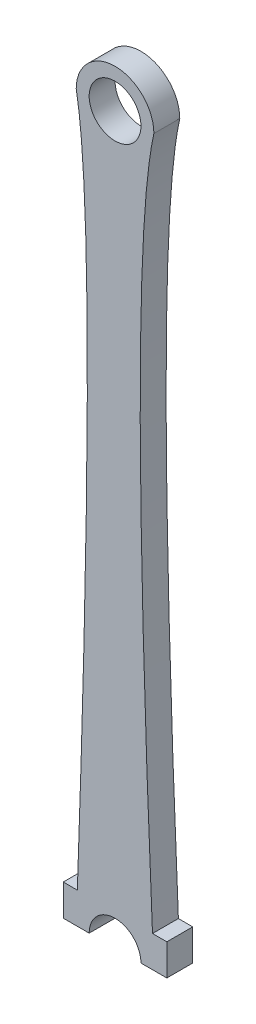
ISO-10303-21;
HEADER;
FILE_DESCRIPTION(('STEP AP214'),'2;1');
FILE_NAME('part.step','',(''),(''),'','','');
FILE_SCHEMA(('AUTOMOTIVE_DESIGN { 1 0 10303 214 1 1 1 1 }'));
ENDSEC;
DATA;
#1=APPLICATION_CONTEXT('core data for automotive mechanical design processes');
#2=APPLICATION_PROTOCOL_DEFINITION('international standard','automotive_design',2000,#1);
#3=PRODUCT_CONTEXT('',#1,'mechanical');
#4=PRODUCT('Part','Part','',(#3));
#5=PRODUCT_RELATED_PRODUCT_CATEGORY('part','',(#4));
#6=PRODUCT_DEFINITION_FORMATION('','',#4);
#7=PRODUCT_DEFINITION_CONTEXT('part definition',#1,'design');
#8=PRODUCT_DEFINITION('design','',#6,#7);
#9=PRODUCT_DEFINITION_SHAPE('','',#8);
#10=(LENGTH_UNIT() NAMED_UNIT(*) SI_UNIT(.MILLI.,.METRE.));
#11=(NAMED_UNIT(*) PLANE_ANGLE_UNIT() SI_UNIT($,.RADIAN.));
#12=(NAMED_UNIT(*) SI_UNIT($,.STERADIAN.) SOLID_ANGLE_UNIT());
#13=UNCERTAINTY_MEASURE_WITH_UNIT(LENGTH_MEASURE(1.E-05),#10,'distance_accuracy_value','');
#14=(GEOMETRIC_REPRESENTATION_CONTEXT(3) GLOBAL_UNCERTAINTY_ASSIGNED_CONTEXT((#13)) GLOBAL_UNIT_ASSIGNED_CONTEXT((#10,
#11,#12)) REPRESENTATION_CONTEXT('',''));
#15=CARTESIAN_POINT('',(0.,0.,0.));
#16=DIRECTION('',(0.,0.,1.));
#17=DIRECTION('',(1.,0.,0.));
#18=AXIS2_PLACEMENT_3D('',#15,#16,#17);
#19=CARTESIAN_POINT('',(0.,-75.2678433281264,10.));
#20=DIRECTION('',(0.,0.,1.));
#21=DIRECTION('',(1.,0.,0.));
#22=AXIS2_PLACEMENT_3D('',#19,#20,#21);
#23=PLANE('',#22);
#24=CARTESIAN_POINT('',(0.,-75.2678433281264,10.));
#25=DIRECTION('',(0.,0.,-1.));
#26=DIRECTION('',(1.,0.,0.));
#27=AXIS2_PLACEMENT_3D('',#24,#25,#26);
#28=CIRCLE('',#27,10.);
#29=CARTESIAN_POINT('',(-10.,-75.2678433281264,10.));
#30=VERTEX_POINT('',#29);
#31=CARTESIAN_POINT('',(10.,-75.2678433281264,10.));
#32=VERTEX_POINT('',#31);
#33=EDGE_CURVE('E182',#30,#32,#28,.T.);
#34=ORIENTED_EDGE('',*,*,#33,.T.);
#35=DIRECTION('',(1.,0.,0.));
#36=VECTOR('',#35,1.);
#37=CARTESIAN_POINT('',(10.,-75.2678433281264,10.));
#38=LINE('',#37,#36);
#39=CARTESIAN_POINT('',(20.,-75.2678433281264,10.));
#40=VERTEX_POINT('',#39);
#41=EDGE_CURVE('E104',#32,#40,#38,.T.);
#42=ORIENTED_EDGE('',*,*,#41,.T.);
#43=DIRECTION('',(0.,1.,0.));
#44=VECTOR('',#43,1.);
#45=CARTESIAN_POINT('',(20.,-75.2678433281264,10.));
#46=LINE('',#45,#44);
#47=CARTESIAN_POINT('',(20.,-63.1536003688616,10.));
#48=VERTEX_POINT('',#47);
#49=EDGE_CURVE('E203',#40,#48,#46,.T.);
#50=ORIENTED_EDGE('',*,*,#49,.T.);
#51=DIRECTION('',(-1.,0.,0.));
#52=VECTOR('',#51,1.);
#53=CARTESIAN_POINT('',(20.,-63.1536003688616,10.));
#54=LINE('',#53,#52);
#55=CARTESIAN_POINT('',(14.4593400547385,-63.1536003688616,10.));
#56=VERTEX_POINT('',#55);
#57=EDGE_CURVE('E220',#48,#56,#54,.T.);
#58=ORIENTED_EDGE('',*,*,#57,.T.);
#59=CARTESIAN_POINT('',(14.4593400547385,-63.1536003688616,10.));
#60=CARTESIAN_POINT('',(7.95408171619363,85.0557570926602,10.));
#61=CARTESIAN_POINT('',(8.13430169794981,174.351009439518,10.));
#62=CARTESIAN_POINT('',(15.,204.732156671874,10.));
#63=B_SPLINE_CURVE_WITH_KNOTS('',3,(#59,#60,#61,#62),.UNSPECIFIED.,.F.,.F.,(4,4),(0.,
0.973750669804579),.UNSPECIFIED.);
#64=CARTESIAN_POINT('',(15.,204.732156671874,10.));
#65=VERTEX_POINT('',#64);
#66=EDGE_CURVE('E217',#56,#65,#63,.T.);
#67=ORIENTED_EDGE('',*,*,#66,.T.);
#68=CARTESIAN_POINT('',(0.,204.732156671874,10.));
#69=DIRECTION('',(0.,0.,1.));
#70=DIRECTION('',(1.,0.,0.));
#71=AXIS2_PLACEMENT_3D('',#68,#69,#70);
#72=CIRCLE('',#71,15.);
#73=CARTESIAN_POINT('',(-15.,204.732156671874,10.));
#74=VERTEX_POINT('',#73);
#75=EDGE_CURVE('E219',#65,#74,#72,.T.);
#76=ORIENTED_EDGE('',*,*,#75,.T.);
#77=CARTESIAN_POINT('',(-15.,204.732156671874,10.));
#78=CARTESIAN_POINT('',(-9.43152327299887,174.70567245247,10.));
#79=CARTESIAN_POINT('',(-9.28569611648617,85.4104201056989,10.));
#80=CARTESIAN_POINT('',(-14.5625185304734,-63.1536003687622,10.));
#81=B_SPLINE_CURVE_WITH_KNOTS('',3,(#77,#78,#79,#80),.UNSPECIFIED.,.F.,.F.,(4,4),(0.,
0.973812020116766),.UNSPECIFIED.);
#82=CARTESIAN_POINT('',(-14.5625185304734,-63.1536003687622,10.));
#83=VERTEX_POINT('',#82);
#84=EDGE_CURVE('E132',#74,#83,#81,.T.);
#85=ORIENTED_EDGE('',*,*,#84,.T.);
#86=DIRECTION('',(-1.,0.,0.));
#87=VECTOR('',#86,1.);
#88=CARTESIAN_POINT('',(-20.,-63.1536003687622,10.));
#89=LINE('',#88,#87);
#90=CARTESIAN_POINT('',(-20.,-63.1536003687622,10.));
#91=VERTEX_POINT('',#90);
#92=EDGE_CURVE('E125',#83,#91,#89,.T.);
#93=ORIENTED_EDGE('',*,*,#92,.T.);
#94=DIRECTION('',(0.,-1.,0.));
#95=VECTOR('',#94,1.);
#96=CARTESIAN_POINT('',(-20.,-75.2678433281264,10.));
#97=LINE('',#96,#95);
#98=CARTESIAN_POINT('',(-20.,-75.2678433281264,10.));
#99=VERTEX_POINT('',#98);
#100=EDGE_CURVE('E129',#91,#99,#97,.T.);
#101=ORIENTED_EDGE('',*,*,#100,.T.);
#102=DIRECTION('',(1.,0.,0.));
#103=VECTOR('',#102,1.);
#104=CARTESIAN_POINT('',(-15.,-75.2678433281264,10.));
#105=LINE('',#104,#103);
#106=EDGE_CURVE('E56',#99,#30,#105,.T.);
#107=ORIENTED_EDGE('',*,*,#106,.T.);
#108=EDGE_LOOP('',(#34,#42,#50,#58,#67,#76,#85,#93,#101,#107));
#109=FACE_BOUND('',#108,.T.);
#110=CARTESIAN_POINT('',(0.,204.732156671874,10.));
#111=DIRECTION('',(0.,0.,1.));
#112=DIRECTION('',(1.,0.,0.));
#113=AXIS2_PLACEMENT_3D('',#110,#111,#112);
#114=CIRCLE('',#113,10.);
#115=CARTESIAN_POINT('',(9.99999999999997,204.732156671874,10.));
#116=VERTEX_POINT('',#115);
#117=EDGE_CURVE('E156',#116,#116,#114,.T.);
#118=ORIENTED_EDGE('',*,*,#117,.F.);
#119=EDGE_LOOP('',(#118));
#120=FACE_BOUND('',#119,.T.);
#121=ADVANCED_FACE('F39',(#109,#120),#23,.T.);
#122=CARTESIAN_POINT('',(0.,-75.2678433281264,0.));
#123=DIRECTION('',(0.,0.,1.));
#124=DIRECTION('',(1.,0.,0.));
#125=AXIS2_PLACEMENT_3D('',#122,#123,#124);
#126=PLANE('',#125);
#127=CARTESIAN_POINT('',(0.,-75.2678433281264,0.));
#128=DIRECTION('',(0.,0.,-1.));
#129=DIRECTION('',(1.,0.,0.));
#130=AXIS2_PLACEMENT_3D('',#127,#128,#129);
#131=CIRCLE('',#130,10.);
#132=CARTESIAN_POINT('',(-10.,-75.2678433281264,0.));
#133=VERTEX_POINT('',#132);
#134=CARTESIAN_POINT('',(10.,-75.2678433281264,0.));
#135=VERTEX_POINT('',#134);
#136=EDGE_CURVE('E152',#133,#135,#131,.T.);
#137=ORIENTED_EDGE('',*,*,#136,.F.);
#138=DIRECTION('',(1.,0.,0.));
#139=VECTOR('',#138,1.);
#140=CARTESIAN_POINT('',(-15.,-75.2678433281264,0.));
#141=LINE('',#140,#139);
#142=CARTESIAN_POINT('',(-20.,-75.2678433281264,0.));
#143=VERTEX_POINT('',#142);
#144=EDGE_CURVE('E92',#143,#133,#141,.T.);
#145=ORIENTED_EDGE('',*,*,#144,.F.);
#146=DIRECTION('',(0.,-1.,0.));
#147=VECTOR('',#146,1.);
#148=CARTESIAN_POINT('',(-20.,-75.2678433281264,0.));
#149=LINE('',#148,#147);
#150=CARTESIAN_POINT('',(-20.,-63.1536003687622,0.));
#151=VERTEX_POINT('',#150);
#152=EDGE_CURVE('E179',#151,#143,#149,.T.);
#153=ORIENTED_EDGE('',*,*,#152,.F.);
#154=DIRECTION('',(-1.,0.,0.));
#155=VECTOR('',#154,1.);
#156=CARTESIAN_POINT('',(-20.,-63.1536003687622,0.));
#157=LINE('',#156,#155);
#158=CARTESIAN_POINT('',(-14.5625185304734,-63.1536003687622,0.));
#159=VERTEX_POINT('',#158);
#160=EDGE_CURVE('E141',#159,#151,#157,.T.);
#161=ORIENTED_EDGE('',*,*,#160,.F.);
#162=CARTESIAN_POINT('',(-15.,204.732156671874,0.));
#163=CARTESIAN_POINT('',(-9.43152327299887,174.70567245247,0.));
#164=CARTESIAN_POINT('',(-9.28569611648617,85.4104201056989,0.));
#165=CARTESIAN_POINT('',(-14.5625185304734,-63.1536003687622,0.));
#166=B_SPLINE_CURVE_WITH_KNOTS('',3,(#162,#163,#164,#165),.UNSPECIFIED.,.F.,.F.,(4,4),(0.,
0.973812020116766),.UNSPECIFIED.);
#167=CARTESIAN_POINT('',(-15.,204.732156671874,0.));
#168=VERTEX_POINT('',#167);
#169=EDGE_CURVE('E171',#168,#159,#166,.T.);
#170=ORIENTED_EDGE('',*,*,#169,.F.);
#171=CARTESIAN_POINT('',(0.,204.732156671874,0.));
#172=DIRECTION('',(0.,0.,1.));
#173=DIRECTION('',(1.,0.,0.));
#174=AXIS2_PLACEMENT_3D('',#171,#172,#173);
#175=CIRCLE('',#174,15.);
#176=CARTESIAN_POINT('',(15.,204.732156671874,0.));
#177=VERTEX_POINT('',#176);
#178=EDGE_CURVE('E166',#177,#168,#175,.T.);
#179=ORIENTED_EDGE('',*,*,#178,.F.);
#180=CARTESIAN_POINT('',(14.4593400547385,-63.1536003688616,0.));
#181=CARTESIAN_POINT('',(7.95408171619363,85.0557570926602,0.));
#182=CARTESIAN_POINT('',(8.13430169794981,174.351009439518,0.));
#183=CARTESIAN_POINT('',(15.,204.732156671874,0.));
#184=B_SPLINE_CURVE_WITH_KNOTS('',3,(#180,#181,#182,#183),.UNSPECIFIED.,.F.,.F.,(4,4),(0.,
0.973750669804579),.UNSPECIFIED.);
#185=CARTESIAN_POINT('',(14.4593400547385,-63.1536003688616,0.));
#186=VERTEX_POINT('',#185);
#187=EDGE_CURVE('E162',#186,#177,#184,.T.);
#188=ORIENTED_EDGE('',*,*,#187,.F.);
#189=DIRECTION('',(-1.,0.,0.));
#190=VECTOR('',#189,1.);
#191=CARTESIAN_POINT('',(20.,-63.1536003688616,0.));
#192=LINE('',#191,#190);
#193=CARTESIAN_POINT('',(20.,-63.1536003688616,0.));
#194=VERTEX_POINT('',#193);
#195=EDGE_CURVE('E160',#194,#186,#192,.T.);
#196=ORIENTED_EDGE('',*,*,#195,.F.);
#197=DIRECTION('',(0.,1.,0.));
#198=VECTOR('',#197,1.);
#199=CARTESIAN_POINT('',(20.,-75.2678433281264,0.));
#200=LINE('',#199,#198);
#201=CARTESIAN_POINT('',(20.,-75.2678433281264,0.));
#202=VERTEX_POINT('',#201);
#203=EDGE_CURVE('E158',#202,#194,#200,.T.);
#204=ORIENTED_EDGE('',*,*,#203,.F.);
#205=DIRECTION('',(1.,0.,0.));
#206=VECTOR('',#205,1.);
#207=CARTESIAN_POINT('',(15.,-75.2678433281264,0.));
#208=LINE('',#207,#206);
#209=EDGE_CURVE('E155',#135,#202,#208,.T.);
#210=ORIENTED_EDGE('',*,*,#209,.F.);
#211=EDGE_LOOP('',(#137,#145,#153,#161,#170,#179,#188,#196,#204,#210));
#212=FACE_BOUND('',#211,.T.);
#213=CARTESIAN_POINT('',(0.,204.732156671874,0.));
#214=DIRECTION('',(0.,0.,1.));
#215=DIRECTION('',(1.,0.,0.));
#216=AXIS2_PLACEMENT_3D('',#213,#214,#215);
#217=CIRCLE('',#216,10.);
#218=CARTESIAN_POINT('',(9.99999999999997,204.732156671874,0.));
#219=VERTEX_POINT('',#218);
#220=EDGE_CURVE('E285',#219,#219,#217,.T.);
#221=ORIENTED_EDGE('',*,*,#220,.T.);
#222=EDGE_LOOP('',(#221));
#223=FACE_BOUND('',#222,.T.);
#224=ADVANCED_FACE('F205',(#212,#223),#126,.F.);
#225=CARTESIAN_POINT('',(0.,-75.2678433281264,10.));
#226=DIRECTION('',(0.,0.,-1.));
#227=DIRECTION('',(-1.,0.,0.));
#228=AXIS2_PLACEMENT_3D('',#225,#226,#227);
#229=CYLINDRICAL_SURFACE('',#228,10.);
#230=ORIENTED_EDGE('',*,*,#136,.T.);
#231=DIRECTION('',(0.,0.,-1.));
#232=VECTOR('',#231,1.);
#233=CARTESIAN_POINT('',(10.,-75.2678433281264,10.));
#234=LINE('',#233,#232);
#235=EDGE_CURVE('E11',#32,#135,#234,.T.);
#236=ORIENTED_EDGE('',*,*,#235,.F.);
#237=ORIENTED_EDGE('',*,*,#33,.F.);
#238=DIRECTION('',(0.,0.,-1.));
#239=VECTOR('',#238,1.);
#240=CARTESIAN_POINT('',(-10.,-75.2678433281264,10.));
#241=LINE('',#240,#239);
#242=EDGE_CURVE('E148',#30,#133,#241,.T.);
#243=ORIENTED_EDGE('',*,*,#242,.T.);
#244=EDGE_LOOP('',(#230,#236,#237,#243));
#245=FACE_BOUND('',#244,.T.);
#246=ADVANCED_FACE('F41',(#245),#229,.F.);
#247=CARTESIAN_POINT('',(15.,-75.2678433281264,10.));
#248=DIRECTION('',(0.,1.,0.));
#249=DIRECTION('',(0.,0.,1.));
#250=AXIS2_PLACEMENT_3D('',#247,#248,#249);
#251=PLANE('',#250);
#252=CARTESIAN_POINT('',(17.,-75.2678433281264,5.));
#253=DIRECTION('',(0.,-1.,0.));
#254=DIRECTION('',(0.,0.,-1.));
#255=AXIS2_PLACEMENT_3D('',#252,#253,#254);
#256=CIRCLE('',#255,1.99999999999999);
#257=CARTESIAN_POINT('',(17.,-75.2678433281264,3.00000000000001));
#258=VERTEX_POINT('',#257);
#259=EDGE_CURVE('E299',#258,#258,#256,.T.);
#260=ORIENTED_EDGE('',*,*,#259,.F.);
#261=EDGE_LOOP('',(#260));
#262=FACE_BOUND('',#261,.T.);
#263=ORIENTED_EDGE('',*,*,#209,.T.);
#264=DIRECTION('',(0.,0.,-1.));
#265=VECTOR('',#264,1.);
#266=CARTESIAN_POINT('',(20.,-75.2678433281264,10.));
#267=LINE('',#266,#265);
#268=EDGE_CURVE('E48',#40,#202,#267,.T.);
#269=ORIENTED_EDGE('',*,*,#268,.F.);
#270=ORIENTED_EDGE('',*,*,#41,.F.);
#271=ORIENTED_EDGE('',*,*,#235,.T.);
#272=EDGE_LOOP('',(#263,#269,#270,#271));
#273=FACE_BOUND('',#272,.T.);
#274=ADVANCED_FACE('F240',(#262,#273),#251,.F.);
#275=CARTESIAN_POINT('',(20.,-75.2678433281264,10.));
#276=DIRECTION('',(-1.,0.,0.));
#277=DIRECTION('',(0.,0.,1.));
#278=AXIS2_PLACEMENT_3D('',#275,#276,#277);
#279=PLANE('',#278);
#280=ORIENTED_EDGE('',*,*,#203,.T.);
#281=DIRECTION('',(0.,0.,-1.));
#282=VECTOR('',#281,1.);
#283=CARTESIAN_POINT('',(20.,-63.1536003688616,10.));
#284=LINE('',#283,#282);
#285=EDGE_CURVE('E195',#48,#194,#284,.T.);
#286=ORIENTED_EDGE('',*,*,#285,.F.);
#287=ORIENTED_EDGE('',*,*,#49,.F.);
#288=ORIENTED_EDGE('',*,*,#268,.T.);
#289=EDGE_LOOP('',(#280,#286,#287,#288));
#290=FACE_BOUND('',#289,.T.);
#291=ADVANCED_FACE('F201',(#290),#279,.F.);
#292=CARTESIAN_POINT('',(20.,-63.1536003688616,10.));
#293=DIRECTION('',(0.,-1.,0.));
#294=DIRECTION('',(0.,0.,-1.));
#295=AXIS2_PLACEMENT_3D('',#292,#293,#294);
#296=PLANE('',#295);
#297=ORIENTED_EDGE('',*,*,#195,.T.);
#298=DIRECTION('',(0.,0.,-1.));
#299=VECTOR('',#298,1.);
#300=CARTESIAN_POINT('',(14.4593400547385,-63.1536003688616,10.));
#301=LINE('',#300,#299);
#302=EDGE_CURVE('E192',#56,#186,#301,.T.);
#303=ORIENTED_EDGE('',*,*,#302,.F.);
#304=ORIENTED_EDGE('',*,*,#57,.F.);
#305=ORIENTED_EDGE('',*,*,#285,.T.);
#306=EDGE_LOOP('',(#297,#303,#304,#305));
#307=FACE_BOUND('',#306,.T.);
#308=ADVANCED_FACE('F211',(#307),#296,.F.);
#309=DIRECTION('',(0.,0.,-1.));
#310=VECTOR('',#309,1.);
#311=SURFACE_OF_LINEAR_EXTRUSION('',#63,#310);
#312=ORIENTED_EDGE('',*,*,#187,.T.);
#313=DIRECTION('',(0.,0.,-1.));
#314=VECTOR('',#313,1.);
#315=CARTESIAN_POINT('',(15.,204.732156671874,10.));
#316=LINE('',#315,#314);
#317=EDGE_CURVE('E189',#65,#177,#316,.T.);
#318=ORIENTED_EDGE('',*,*,#317,.F.);
#319=ORIENTED_EDGE('',*,*,#66,.F.);
#320=ORIENTED_EDGE('',*,*,#302,.T.);
#321=EDGE_LOOP('',(#312,#318,#319,#320));
#322=FACE_BOUND('',#321,.T.);
#323=ADVANCED_FACE('F215',(#322),#311,.F.);
#324=CARTESIAN_POINT('',(0.,204.732156671874,10.));
#325=DIRECTION('',(0.,0.,-1.));
#326=DIRECTION('',(-1.,0.,0.));
#327=AXIS2_PLACEMENT_3D('',#324,#325,#326);
#328=CYLINDRICAL_SURFACE('',#327,15.);
#329=ORIENTED_EDGE('',*,*,#178,.T.);
#330=DIRECTION('',(0.,0.,-1.));
#331=VECTOR('',#330,1.);
#332=CARTESIAN_POINT('',(-15.,204.732156671874,10.));
#333=LINE('',#332,#331);
#334=EDGE_CURVE('E186',#74,#168,#333,.T.);
#335=ORIENTED_EDGE('',*,*,#334,.F.);
#336=ORIENTED_EDGE('',*,*,#75,.F.);
#337=ORIENTED_EDGE('',*,*,#317,.T.);
#338=EDGE_LOOP('',(#329,#335,#336,#337));
#339=FACE_BOUND('',#338,.T.);
#340=ADVANCED_FACE('F235',(#339),#328,.T.);
#341=DIRECTION('',(0.,0.,-1.));
#342=VECTOR('',#341,1.);
#343=SURFACE_OF_LINEAR_EXTRUSION('',#81,#342);
#344=ORIENTED_EDGE('',*,*,#169,.T.);
#345=DIRECTION('',(0.,0.,-1.));
#346=VECTOR('',#345,1.);
#347=CARTESIAN_POINT('',(-14.5625185304734,-63.1536003687622,10.));
#348=LINE('',#347,#346);
#349=EDGE_CURVE('E143',#83,#159,#348,.T.);
#350=ORIENTED_EDGE('',*,*,#349,.F.);
#351=ORIENTED_EDGE('',*,*,#84,.F.);
#352=ORIENTED_EDGE('',*,*,#334,.T.);
#353=EDGE_LOOP('',(#344,#350,#351,#352));
#354=FACE_BOUND('',#353,.T.);
#355=ADVANCED_FACE('F265',(#354),#343,.F.);
#356=CARTESIAN_POINT('',(-20.,-63.1536003687622,10.));
#357=DIRECTION('',(0.,-1.,0.));
#358=DIRECTION('',(0.,0.,-1.));
#359=AXIS2_PLACEMENT_3D('',#356,#357,#358);
#360=PLANE('',#359);
#361=ORIENTED_EDGE('',*,*,#160,.T.);
#362=DIRECTION('',(0.,0.,-1.));
#363=VECTOR('',#362,1.);
#364=CARTESIAN_POINT('',(-20.,-63.1536003687622,10.));
#365=LINE('',#364,#363);
#366=EDGE_CURVE('E138',#91,#151,#365,.T.);
#367=ORIENTED_EDGE('',*,*,#366,.F.);
#368=ORIENTED_EDGE('',*,*,#92,.F.);
#369=ORIENTED_EDGE('',*,*,#349,.T.);
#370=EDGE_LOOP('',(#361,#367,#368,#369));
#371=FACE_BOUND('',#370,.T.);
#372=ADVANCED_FACE('F139',(#371),#360,.F.);
#373=CARTESIAN_POINT('',(-20.,-75.2678433281264,10.));
#374=DIRECTION('',(1.,0.,0.));
#375=DIRECTION('',(0.,0.,-1.));
#376=AXIS2_PLACEMENT_3D('',#373,#374,#375);
#377=PLANE('',#376);
#378=ORIENTED_EDGE('',*,*,#152,.T.);
#379=DIRECTION('',(0.,0.,-1.));
#380=VECTOR('',#379,1.);
#381=CARTESIAN_POINT('',(-20.,-75.2678433281264,10.));
#382=LINE('',#381,#380);
#383=EDGE_CURVE('E144',#99,#143,#382,.T.);
#384=ORIENTED_EDGE('',*,*,#383,.F.);
#385=ORIENTED_EDGE('',*,*,#100,.F.);
#386=ORIENTED_EDGE('',*,*,#366,.T.);
#387=EDGE_LOOP('',(#378,#384,#385,#386));
#388=FACE_BOUND('',#387,.T.);
#389=ADVANCED_FACE('F146',(#388),#377,.F.);
#390=CARTESIAN_POINT('',(-15.,-75.2678433281264,10.));
#391=DIRECTION('',(0.,1.,0.));
#392=DIRECTION('',(0.,0.,1.));
#393=AXIS2_PLACEMENT_3D('',#390,#391,#392);
#394=PLANE('',#393);
#395=CARTESIAN_POINT('',(-17.,-75.2678433281264,5.));
#396=DIRECTION('',(0.,-1.,0.));
#397=DIRECTION('',(0.,0.,-1.));
#398=AXIS2_PLACEMENT_3D('',#395,#396,#397);
#399=CIRCLE('',#398,1.99999999999999);
#400=CARTESIAN_POINT('',(-17.,-75.2678433281264,3.00000000000001));
#401=VERTEX_POINT('',#400);
#402=EDGE_CURVE('E293',#401,#401,#399,.T.);
#403=ORIENTED_EDGE('',*,*,#402,.F.);
#404=EDGE_LOOP('',(#403));
#405=FACE_BOUND('',#404,.T.);
#406=ORIENTED_EDGE('',*,*,#144,.T.);
#407=ORIENTED_EDGE('',*,*,#242,.F.);
#408=ORIENTED_EDGE('',*,*,#106,.F.);
#409=ORIENTED_EDGE('',*,*,#383,.T.);
#410=EDGE_LOOP('',(#406,#407,#408,#409));
#411=FACE_BOUND('',#410,.T.);
#412=ADVANCED_FACE('F258',(#405,#411),#394,.F.);
#413=CARTESIAN_POINT('',(0.,204.732156671874,10.));
#414=DIRECTION('',(0.,0.,-1.));
#415=DIRECTION('',(-1.,0.,0.));
#416=AXIS2_PLACEMENT_3D('',#413,#414,#415);
#417=CYLINDRICAL_SURFACE('',#416,10.);
#418=ORIENTED_EDGE('',*,*,#117,.T.);
#419=EDGE_LOOP('',(#418));
#420=FACE_BOUND('',#419,.T.);
#421=ORIENTED_EDGE('',*,*,#220,.F.);
#422=EDGE_LOOP('',(#421));
#423=FACE_BOUND('',#422,.T.);
#424=ADVANCED_FACE('F255',(#420,#423),#417,.F.);
#425=CARTESIAN_POINT('',(-17.,-65.2678433281264,5.));
#426=DIRECTION('',(0.,-1.,0.));
#427=DIRECTION('',(0.,0.,-1.));
#428=AXIS2_PLACEMENT_3D('',#425,#426,#427);
#429=CONICAL_SURFACE('',#428,1.99999999999999,1.02974425867665);
#430=CARTESIAN_POINT('',(-17.,-64.0661220900713,5.));
#431=VERTEX_POINT('',#430);
#432=VERTEX_LOOP('',#431);
#433=FACE_BOUND('',#432,.T.);
#434=CARTESIAN_POINT('',(-17.,-65.2678433281264,5.));
#435=DIRECTION('',(0.,-1.,0.));
#436=DIRECTION('',(0.,0.,-1.));
#437=AXIS2_PLACEMENT_3D('',#434,#435,#436);
#438=CIRCLE('',#437,1.99999999999999);
#439=CARTESIAN_POINT('',(-17.,-65.2678433281264,3.00000000000001));
#440=VERTEX_POINT('',#439);
#441=EDGE_CURVE('E288',#440,#440,#438,.T.);
#442=ORIENTED_EDGE('',*,*,#441,.T.);
#443=EDGE_LOOP('',(#442));
#444=FACE_BOUND('',#443,.T.);
#445=ADVANCED_FACE('F316',(#433,#444),#429,.F.);
#446=CARTESIAN_POINT('',(-17.,-75.2678433281264,5.));
#447=DIRECTION('',(0.,-1.,0.));
#448=DIRECTION('',(0.,0.,-1.));
#449=AXIS2_PLACEMENT_3D('',#446,#447,#448);
#450=CYLINDRICAL_SURFACE('',#449,1.99999999999999);
#451=ORIENTED_EDGE('',*,*,#441,.F.);
#452=EDGE_LOOP('',(#451));
#453=FACE_BOUND('',#452,.T.);
#454=ORIENTED_EDGE('',*,*,#402,.T.);
#455=EDGE_LOOP('',(#454));
#456=FACE_BOUND('',#455,.T.);
#457=ADVANCED_FACE('F310',(#453,#456),#450,.F.);
#458=CARTESIAN_POINT('',(17.,-65.2678433281264,5.));
#459=DIRECTION('',(0.,-1.,0.));
#460=DIRECTION('',(0.,0.,-1.));
#461=AXIS2_PLACEMENT_3D('',#458,#459,#460);
#462=CONICAL_SURFACE('',#461,1.99999999999999,1.02974425867665);
#463=CARTESIAN_POINT('',(17.,-64.0661220900713,5.));
#464=VERTEX_POINT('',#463);
#465=VERTEX_LOOP('',#464);
#466=FACE_BOUND('',#465,.T.);
#467=CARTESIAN_POINT('',(17.,-65.2678433281264,5.));
#468=DIRECTION('',(0.,-1.,0.));
#469=DIRECTION('',(0.,0.,-1.));
#470=AXIS2_PLACEMENT_3D('',#467,#468,#469);
#471=CIRCLE('',#470,1.99999999999999);
#472=CARTESIAN_POINT('',(17.,-65.2678433281264,3.00000000000001));
#473=VERTEX_POINT('',#472);
#474=EDGE_CURVE('E296',#473,#473,#471,.T.);
#475=ORIENTED_EDGE('',*,*,#474,.T.);
#476=EDGE_LOOP('',(#475));
#477=FACE_BOUND('',#476,.T.);
#478=ADVANCED_FACE('F304',(#466,#477),#462,.F.);
#479=CARTESIAN_POINT('',(17.,-75.2678433281264,5.));
#480=DIRECTION('',(0.,-1.,0.));
#481=DIRECTION('',(0.,0.,-1.));
#482=AXIS2_PLACEMENT_3D('',#479,#480,#481);
#483=CYLINDRICAL_SURFACE('',#482,1.99999999999999);
#484=ORIENTED_EDGE('',*,*,#474,.F.);
#485=EDGE_LOOP('',(#484));
#486=FACE_BOUND('',#485,.T.);
#487=ORIENTED_EDGE('',*,*,#259,.T.);
#488=EDGE_LOOP('',(#487));
#489=FACE_BOUND('',#488,.T.);
#490=ADVANCED_FACE('F302',(#486,#489),#483,.F.);
#491=CLOSED_SHELL('',(#121,#224,#246,#274,#291,#308,#323,#340,#355,#372,#389,#412,#424,#445,
#457,#478,#490));
#492=MANIFOLD_SOLID_BREP('B2',#491);
#493=ADVANCED_BREP_SHAPE_REPRESENTATION('',(#18,#492),#14);
#494=SHAPE_DEFINITION_REPRESENTATION(#9,#493);
ENDSEC;
END-ISO-10303-21;
